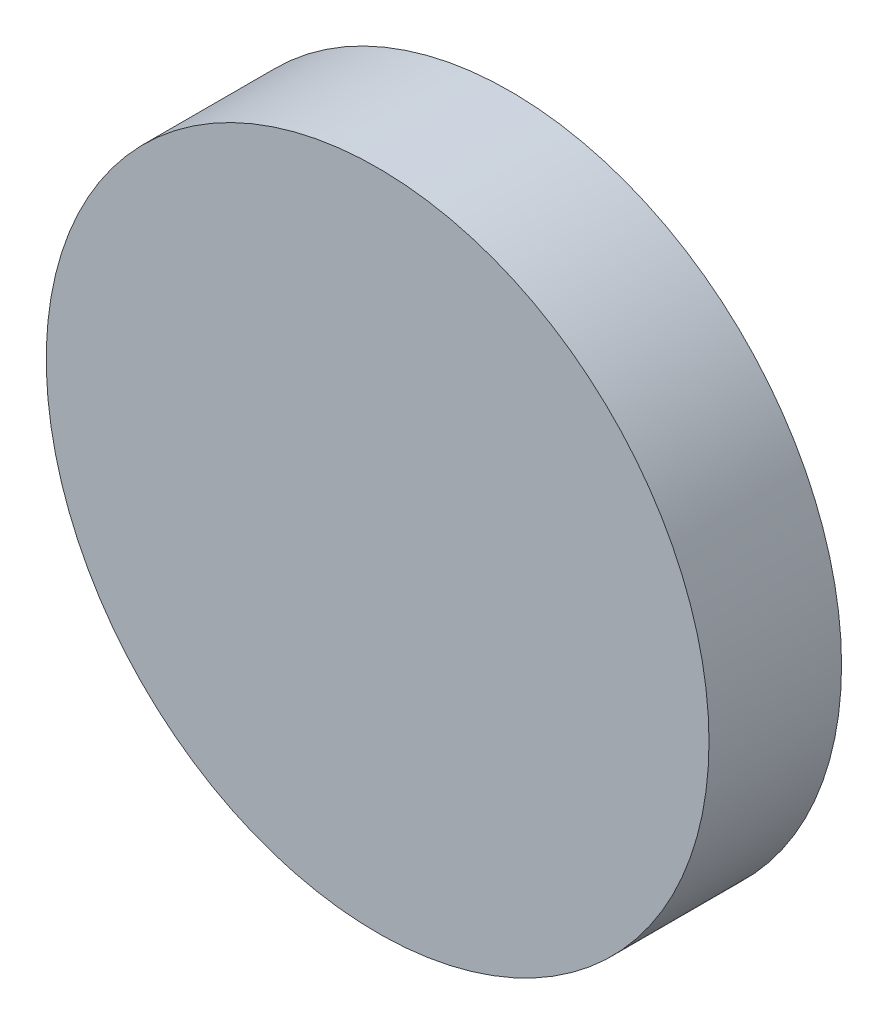
ISO-10303-21;
HEADER;
FILE_DESCRIPTION(('STEP AP214'),'2;1');
FILE_NAME('part.step','',(''),(''),'','','');
FILE_SCHEMA(('AUTOMOTIVE_DESIGN { 1 0 10303 214 1 1 1 1 }'));
ENDSEC;
DATA;
#1=APPLICATION_CONTEXT('core data for automotive mechanical design processes');
#2=APPLICATION_PROTOCOL_DEFINITION('international standard','automotive_design',2000,#1);
#3=PRODUCT_CONTEXT('',#1,'mechanical');
#4=PRODUCT('Part','Part','',(#3));
#5=PRODUCT_RELATED_PRODUCT_CATEGORY('part','',(#4));
#6=PRODUCT_DEFINITION_FORMATION('','',#4);
#7=PRODUCT_DEFINITION_CONTEXT('part definition',#1,'design');
#8=PRODUCT_DEFINITION('design','',#6,#7);
#9=PRODUCT_DEFINITION_SHAPE('','',#8);
#10=(LENGTH_UNIT() NAMED_UNIT(*) SI_UNIT(.MILLI.,.METRE.));
#11=(NAMED_UNIT(*) PLANE_ANGLE_UNIT() SI_UNIT($,.RADIAN.));
#12=(NAMED_UNIT(*) SI_UNIT($,.STERADIAN.) SOLID_ANGLE_UNIT());
#13=UNCERTAINTY_MEASURE_WITH_UNIT(LENGTH_MEASURE(1.E-05),#10,'distance_accuracy_value','');
#14=(GEOMETRIC_REPRESENTATION_CONTEXT(3) GLOBAL_UNCERTAINTY_ASSIGNED_CONTEXT((#13)) GLOBAL_UNIT_ASSIGNED_CONTEXT((#10,
#11,#12)) REPRESENTATION_CONTEXT('',''));
#15=CARTESIAN_POINT('',(0.,0.,0.));
#16=DIRECTION('',(0.,0.,1.));
#17=DIRECTION('',(1.,0.,0.));
#18=AXIS2_PLACEMENT_3D('',#15,#16,#17);
#19=CARTESIAN_POINT('',(0.,0.,2.54));
#20=DIRECTION('',(0.,0.,-1.));
#21=DIRECTION('',(-1.,0.,0.));
#22=AXIS2_PLACEMENT_3D('',#19,#20,#21);
#23=CYLINDRICAL_SURFACE('',#22,12.7);
#24=CARTESIAN_POINT('',(0.,0.,2.54));
#25=DIRECTION('',(0.,0.,1.));
#26=DIRECTION('',(1.,0.,0.));
#27=AXIS2_PLACEMENT_3D('',#24,#25,#26);
#28=CIRCLE('',#27,12.7);
#29=CARTESIAN_POINT('',(12.7,0.,2.54));
#30=VERTEX_POINT('',#29);
#31=EDGE_CURVE('E10',#30,#30,#28,.T.);
#32=ORIENTED_EDGE('',*,*,#31,.F.);
#33=EDGE_LOOP('',(#32));
#34=FACE_BOUND('',#33,.T.);
#35=CARTESIAN_POINT('',(0.,0.,-2.54));
#36=DIRECTION('',(0.,0.,1.));
#37=DIRECTION('',(1.,0.,0.));
#38=AXIS2_PLACEMENT_3D('',#35,#36,#37);
#39=CIRCLE('',#38,12.7);
#40=CARTESIAN_POINT('',(12.7,0.,-2.54));
#41=VERTEX_POINT('',#40);
#42=EDGE_CURVE('E37',#41,#41,#39,.T.);
#43=ORIENTED_EDGE('',*,*,#42,.T.);
#44=EDGE_LOOP('',(#43));
#45=FACE_BOUND('',#44,.T.);
#46=ADVANCED_FACE('F34',(#34,#45),#23,.T.);
#47=CARTESIAN_POINT('',(0.,0.,2.54));
#48=DIRECTION('',(0.,0.,1.));
#49=DIRECTION('',(1.,0.,0.));
#50=AXIS2_PLACEMENT_3D('',#47,#48,#49);
#51=PLANE('',#50);
#52=ORIENTED_EDGE('',*,*,#31,.T.);
#53=EDGE_LOOP('',(#52));
#54=FACE_BOUND('',#53,.T.);
#55=ADVANCED_FACE('F49',(#54),#51,.T.);
#56=CARTESIAN_POINT('',(0.,0.,-2.54));
#57=DIRECTION('',(0.,0.,1.));
#58=DIRECTION('',(1.,0.,0.));
#59=AXIS2_PLACEMENT_3D('',#56,#57,#58);
#60=PLANE('',#59);
#61=ORIENTED_EDGE('',*,*,#42,.F.);
#62=EDGE_LOOP('',(#61));
#63=FACE_BOUND('',#62,.T.);
#64=ADVANCED_FACE('F47',(#63),#60,.F.);
#65=CLOSED_SHELL('',(#46,#55,#64));
#66=MANIFOLD_SOLID_BREP('B2',#65);
#67=ADVANCED_BREP_SHAPE_REPRESENTATION('',(#18,#66),#14);
#68=SHAPE_DEFINITION_REPRESENTATION(#9,#67);
ENDSEC;
END-ISO-10303-21;
